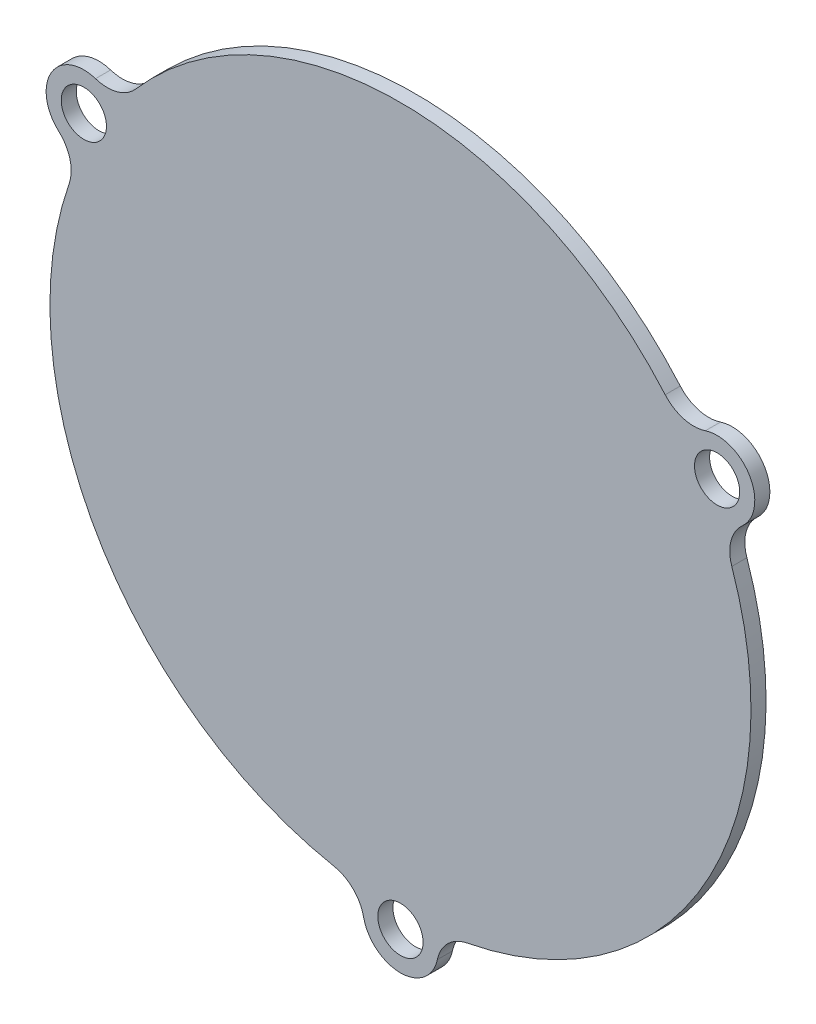
ISO-10303-21;
HEADER;
FILE_DESCRIPTION(('STEP AP214'),'2;1');
FILE_NAME('part.step','',(''),(''),'','','');
FILE_SCHEMA(('AUTOMOTIVE_DESIGN { 1 0 10303 214 1 1 1 1 }'));
ENDSEC;
DATA;
#1=APPLICATION_CONTEXT('core data for automotive mechanical design processes');
#2=APPLICATION_PROTOCOL_DEFINITION('international standard','automotive_design',2000,#1);
#3=PRODUCT_CONTEXT('',#1,'mechanical');
#4=PRODUCT('Part','Part','',(#3));
#5=PRODUCT_RELATED_PRODUCT_CATEGORY('part','',(#4));
#6=PRODUCT_DEFINITION_FORMATION('','',#4);
#7=PRODUCT_DEFINITION_CONTEXT('part definition',#1,'design');
#8=PRODUCT_DEFINITION('design','',#6,#7);
#9=PRODUCT_DEFINITION_SHAPE('','',#8);
#10=(LENGTH_UNIT() NAMED_UNIT(*) SI_UNIT(.MILLI.,.METRE.));
#11=(NAMED_UNIT(*) PLANE_ANGLE_UNIT() SI_UNIT($,.RADIAN.));
#12=(NAMED_UNIT(*) SI_UNIT($,.STERADIAN.) SOLID_ANGLE_UNIT());
#13=UNCERTAINTY_MEASURE_WITH_UNIT(LENGTH_MEASURE(1.E-05),#10,'distance_accuracy_value','');
#14=(GEOMETRIC_REPRESENTATION_CONTEXT(3) GLOBAL_UNCERTAINTY_ASSIGNED_CONTEXT((#13)) GLOBAL_UNIT_ASSIGNED_CONTEXT((#10,
#11,#12)) REPRESENTATION_CONTEXT('',''));
#15=CARTESIAN_POINT('',(0.,0.,0.));
#16=DIRECTION('',(0.,0.,1.));
#17=DIRECTION('',(1.,0.,0.));
#18=AXIS2_PLACEMENT_3D('',#15,#16,#17);
#19=CARTESIAN_POINT('',(-9.78512908426163,-50.5618556701031,4.));
#20=DIRECTION('',(0.,0.,1.));
#21=DIRECTION('',(1.,0.,0.));
#22=AXIS2_PLACEMENT_3D('',#19,#20,#21);
#23=PLANE('',#22);
#24=CARTESIAN_POINT('',(84.004464167091,48.4999999999992,4.));
#25=DIRECTION('',(0.,0.,1.));
#26=DIRECTION('',(1.,0.,0.));
#27=AXIS2_PLACEMENT_3D('',#24,#25,#26);
#28=CIRCLE('',#27,6.);
#29=CARTESIAN_POINT('',(90.004464167091,48.4999999999991,4.));
#30=VERTEX_POINT('',#29);
#31=EDGE_CURVE('E300',#30,#30,#28,.T.);
#32=ORIENTED_EDGE('',*,*,#31,.F.);
#33=EDGE_LOOP('',(#32));
#34=FACE_BOUND('',#33,.T.);
#35=CARTESIAN_POINT('',(0.,0.,4.));
#36=DIRECTION('',(0.,0.,1.));
#37=DIRECTION('',(1.,0.,0.));
#38=AXIS2_PLACEMENT_3D('',#35,#36,#37);
#39=CIRCLE('',#38,93.);
#40=CARTESIAN_POINT('',(-87.908324065782,30.3500668853539,4.));
#41=VERTEX_POINT('',#40);
#42=CARTESIAN_POINT('',(-17.6702331036181,-91.305875287759,4.));
#43=VERTEX_POINT('',#42);
#44=EDGE_CURVE('E165',#41,#43,#39,.T.);
#45=ORIENTED_EDGE('',*,*,#44,.T.);
#46=CARTESIAN_POINT('',(-19.5702581685232,-101.123711340206,4.));
#47=DIRECTION('',(0.,0.,-1.));
#48=DIRECTION('',(1.,0.,0.));
#49=AXIS2_PLACEMENT_3D('',#46,#47,#48);
#50=CIRCLE('',#49,9.99999999999999);
#51=CARTESIAN_POINT('',(-9.78512908426157,-99.0618556701031,4.));
#52=VERTEX_POINT('',#51);
#53=EDGE_CURVE('E134',#43,#52,#50,.T.);
#54=ORIENTED_EDGE('',*,*,#53,.T.);
#55=CARTESIAN_POINT('',(1.19595284297793E-13,-97.,4.));
#56=DIRECTION('',(0.,0.,1.));
#57=DIRECTION('',(1.,0.,0.));
#58=AXIS2_PLACEMENT_3D('',#55,#56,#57);
#59=CIRCLE('',#58,10.);
#60=CARTESIAN_POINT('',(9.7851290842618,-99.0618556701031,4.));
#61=VERTEX_POINT('',#60);
#62=EDGE_CURVE('E168',#52,#61,#59,.T.);
#63=ORIENTED_EDGE('',*,*,#62,.T.);
#64=CARTESIAN_POINT('',(19.5702581685235,-101.123711340206,4.));
#65=DIRECTION('',(0.,0.,-1.));
#66=DIRECTION('',(1.,0.,0.));
#67=AXIS2_PLACEMENT_3D('',#64,#65,#66);
#68=CIRCLE('',#67,10.);
#69=CARTESIAN_POINT('',(17.6702331036183,-91.305875287759,4.));
#70=VERTEX_POINT('',#69);
#71=EDGE_CURVE('E170',#61,#70,#68,.T.);
#72=ORIENTED_EDGE('',*,*,#71,.T.);
#73=CARTESIAN_POINT('',(0.,0.,4.));
#74=DIRECTION('',(0.,0.,1.));
#75=DIRECTION('',(1.,0.,0.));
#76=AXIS2_PLACEMENT_3D('',#73,#74,#75);
#77=CIRCLE('',#76,93.);
#78=CARTESIAN_POINT('',(87.9083240657825,30.3500668853525,4.));
#79=VERTEX_POINT('',#78);
#80=EDGE_CURVE('E172',#70,#79,#77,.T.);
#81=ORIENTED_EDGE('',*,*,#80,.T.);
#82=CARTESIAN_POINT('',(97.3608320298451,33.6135149375409,4.));
#83=DIRECTION('',(0.,0.,-1.));
#84=DIRECTION('',(1.,0.,0.));
#85=AXIS2_PLACEMENT_3D('',#82,#83,#84);
#86=CIRCLE('',#85,10.);
#87=CARTESIAN_POINT('',(90.6826480984681,41.0567574687701,4.));
#88=VERTEX_POINT('',#87);
#89=EDGE_CURVE('E174',#79,#88,#86,.T.);
#90=ORIENTED_EDGE('',*,*,#89,.T.);
#91=CARTESIAN_POINT('',(84.004464167091,48.4999999999992,4.));
#92=DIRECTION('',(0.,0.,1.));
#93=DIRECTION('',(1.,0.,0.));
#94=AXIS2_PLACEMENT_3D('',#91,#92,#93);
#95=CIRCLE('',#94,10.);
#96=CARTESIAN_POINT('',(80.8975190142065,58.0050982013313,4.));
#97=VERTEX_POINT('',#96);
#98=EDGE_CURVE('E176',#88,#97,#95,.T.);
#99=ORIENTED_EDGE('',*,*,#98,.T.);
#100=CARTESIAN_POINT('',(77.7905738613219,67.5101964026634,4.));
#101=DIRECTION('',(0.,0.,-1.));
#102=DIRECTION('',(1.,0.,0.));
#103=AXIS2_PLACEMENT_3D('',#100,#101,#102);
#104=CIRCLE('',#103,10.);
#105=CARTESIAN_POINT('',(70.2380909621645,60.9558084024049,4.));
#106=VERTEX_POINT('',#105);
#107=EDGE_CURVE('E178',#97,#106,#104,.T.);
#108=ORIENTED_EDGE('',*,*,#107,.T.);
#109=CARTESIAN_POINT('',(0.,0.,4.));
#110=DIRECTION('',(0.,0.,1.));
#111=DIRECTION('',(1.,0.,0.));
#112=AXIS2_PLACEMENT_3D('',#109,#110,#111);
#113=CIRCLE('',#112,93.);
#114=CARTESIAN_POINT('',(-70.2380909621637,60.955808402406,4.));
#115=VERTEX_POINT('',#114);
#116=EDGE_CURVE('E180',#106,#115,#113,.T.);
#117=ORIENTED_EDGE('',*,*,#116,.T.);
#118=CARTESIAN_POINT('',(-77.7905738613212,67.5101964026647,4.));
#119=DIRECTION('',(0.,0.,-1.));
#120=DIRECTION('',(1.,0.,0.));
#121=AXIS2_PLACEMENT_3D('',#118,#119,#120);
#122=CIRCLE('',#121,10.);
#123=CARTESIAN_POINT('',(-80.8975190142057,58.0050982013326,4.));
#124=VERTEX_POINT('',#123);
#125=EDGE_CURVE('E182',#115,#124,#122,.T.);
#126=ORIENTED_EDGE('',*,*,#125,.T.);
#127=CARTESIAN_POINT('',(-84.0044641670903,48.5000000000005,4.));
#128=DIRECTION('',(0.,0.,1.));
#129=DIRECTION('',(1.,0.,0.));
#130=AXIS2_PLACEMENT_3D('',#127,#128,#129);
#131=CIRCLE('',#130,10.);
#132=CARTESIAN_POINT('',(-90.6826480984675,41.0567574687715,4.));
#133=VERTEX_POINT('',#132);
#134=EDGE_CURVE('E51',#124,#133,#131,.T.);
#135=ORIENTED_EDGE('',*,*,#134,.T.);
#136=CARTESIAN_POINT('',(-97.3608320298446,33.6135149375425,4.));
#137=DIRECTION('',(0.,0.,-1.));
#138=DIRECTION('',(1.,0.,0.));
#139=AXIS2_PLACEMENT_3D('',#136,#137,#138);
#140=CIRCLE('',#139,10.);
#141=EDGE_CURVE('E46',#133,#41,#140,.T.);
#142=ORIENTED_EDGE('',*,*,#141,.T.);
#143=EDGE_LOOP('',(#45,#54,#63,#72,#81,#90,#99,#108,#117,#126,#135,#142));
#144=FACE_BOUND('',#143,.T.);
#145=CARTESIAN_POINT('',(1.19595284297793E-13,-97.,4.));
#146=DIRECTION('',(0.,0.,1.));
#147=DIRECTION('',(1.,0.,0.));
#148=AXIS2_PLACEMENT_3D('',#145,#146,#147);
#149=CIRCLE('',#148,6.);
#150=CARTESIAN_POINT('',(6.00000000000012,-97.,4.));
#151=VERTEX_POINT('',#150);
#152=EDGE_CURVE('E139',#151,#151,#149,.T.);
#153=ORIENTED_EDGE('',*,*,#152,.F.);
#154=EDGE_LOOP('',(#153));
#155=FACE_BOUND('',#154,.T.);
#156=CARTESIAN_POINT('',(-84.0044641670903,48.5000000000005,4.));
#157=DIRECTION('',(0.,0.,1.));
#158=DIRECTION('',(1.,0.,0.));
#159=AXIS2_PLACEMENT_3D('',#156,#157,#158);
#160=CIRCLE('',#159,6.);
#161=CARTESIAN_POINT('',(-78.0044641670903,48.5000000000005,4.));
#162=VERTEX_POINT('',#161);
#163=EDGE_CURVE('E289',#162,#162,#160,.T.);
#164=ORIENTED_EDGE('',*,*,#163,.F.);
#165=EDGE_LOOP('',(#164));
#166=FACE_BOUND('',#165,.T.);
#167=ADVANCED_FACE('F31',(#34,#144,#155,#166),#23,.T.);
#168=CARTESIAN_POINT('',(-9.78512908426163,-50.5618556701031,0.));
#169=DIRECTION('',(0.,0.,1.));
#170=DIRECTION('',(1.,0.,0.));
#171=AXIS2_PLACEMENT_3D('',#168,#169,#170);
#172=PLANE('',#171);
#173=CARTESIAN_POINT('',(84.004464167091,48.4999999999992,0.));
#174=DIRECTION('',(0.,0.,1.));
#175=DIRECTION('',(1.,0.,0.));
#176=AXIS2_PLACEMENT_3D('',#173,#174,#175);
#177=CIRCLE('',#176,6.);
#178=CARTESIAN_POINT('',(90.004464167091,48.4999999999991,0.));
#179=VERTEX_POINT('',#178);
#180=EDGE_CURVE('E295',#179,#179,#177,.T.);
#181=ORIENTED_EDGE('',*,*,#180,.T.);
#182=EDGE_LOOP('',(#181));
#183=FACE_BOUND('',#182,.T.);
#184=CARTESIAN_POINT('',(0.,0.,0.));
#185=DIRECTION('',(0.,0.,1.));
#186=DIRECTION('',(1.,0.,0.));
#187=AXIS2_PLACEMENT_3D('',#184,#185,#186);
#188=CIRCLE('',#187,93.);
#189=CARTESIAN_POINT('',(-87.908324065782,30.3500668853539,0.));
#190=VERTEX_POINT('',#189);
#191=CARTESIAN_POINT('',(-17.6702331036181,-91.305875287759,0.));
#192=VERTEX_POINT('',#191);
#193=EDGE_CURVE('E125',#190,#192,#188,.T.);
#194=ORIENTED_EDGE('',*,*,#193,.F.);
#195=CARTESIAN_POINT('',(-97.3608320298446,33.6135149375425,0.));
#196=DIRECTION('',(0.,0.,-1.));
#197=DIRECTION('',(1.,0.,0.));
#198=AXIS2_PLACEMENT_3D('',#195,#196,#197);
#199=CIRCLE('',#198,10.);
#200=CARTESIAN_POINT('',(-90.6826480984675,41.0567574687715,0.));
#201=VERTEX_POINT('',#200);
#202=EDGE_CURVE('E163',#201,#190,#199,.T.);
#203=ORIENTED_EDGE('',*,*,#202,.F.);
#204=CARTESIAN_POINT('',(-84.0044641670903,48.5000000000005,0.));
#205=DIRECTION('',(0.,0.,1.));
#206=DIRECTION('',(1.,0.,0.));
#207=AXIS2_PLACEMENT_3D('',#204,#205,#206);
#208=CIRCLE('',#207,10.);
#209=CARTESIAN_POINT('',(-80.8975190142057,58.0050982013326,0.));
#210=VERTEX_POINT('',#209);
#211=EDGE_CURVE('E161',#210,#201,#208,.T.);
#212=ORIENTED_EDGE('',*,*,#211,.F.);
#213=CARTESIAN_POINT('',(-77.7905738613212,67.5101964026647,0.));
#214=DIRECTION('',(0.,0.,-1.));
#215=DIRECTION('',(1.,0.,0.));
#216=AXIS2_PLACEMENT_3D('',#213,#214,#215);
#217=CIRCLE('',#216,10.);
#218=CARTESIAN_POINT('',(-70.2380909621637,60.955808402406,0.));
#219=VERTEX_POINT('',#218);
#220=EDGE_CURVE('E159',#219,#210,#217,.T.);
#221=ORIENTED_EDGE('',*,*,#220,.F.);
#222=CARTESIAN_POINT('',(0.,0.,0.));
#223=DIRECTION('',(0.,0.,1.));
#224=DIRECTION('',(1.,0.,0.));
#225=AXIS2_PLACEMENT_3D('',#222,#223,#224);
#226=CIRCLE('',#225,93.);
#227=CARTESIAN_POINT('',(70.2380909621645,60.9558084024049,0.));
#228=VERTEX_POINT('',#227);
#229=EDGE_CURVE('E157',#228,#219,#226,.T.);
#230=ORIENTED_EDGE('',*,*,#229,.F.);
#231=CARTESIAN_POINT('',(77.7905738613219,67.5101964026634,0.));
#232=DIRECTION('',(0.,0.,-1.));
#233=DIRECTION('',(1.,0.,0.));
#234=AXIS2_PLACEMENT_3D('',#231,#232,#233);
#235=CIRCLE('',#234,10.);
#236=CARTESIAN_POINT('',(80.8975190142065,58.0050982013313,0.));
#237=VERTEX_POINT('',#236);
#238=EDGE_CURVE('E155',#237,#228,#235,.T.);
#239=ORIENTED_EDGE('',*,*,#238,.F.);
#240=CARTESIAN_POINT('',(84.004464167091,48.4999999999992,0.));
#241=DIRECTION('',(0.,0.,1.));
#242=DIRECTION('',(1.,0.,0.));
#243=AXIS2_PLACEMENT_3D('',#240,#241,#242);
#244=CIRCLE('',#243,10.);
#245=CARTESIAN_POINT('',(90.6826480984681,41.0567574687701,0.));
#246=VERTEX_POINT('',#245);
#247=EDGE_CURVE('E153',#246,#237,#244,.T.);
#248=ORIENTED_EDGE('',*,*,#247,.F.);
#249=CARTESIAN_POINT('',(97.3608320298451,33.6135149375409,0.));
#250=DIRECTION('',(0.,0.,-1.));
#251=DIRECTION('',(1.,0.,0.));
#252=AXIS2_PLACEMENT_3D('',#249,#250,#251);
#253=CIRCLE('',#252,10.);
#254=CARTESIAN_POINT('',(87.9083240657825,30.3500668853525,0.));
#255=VERTEX_POINT('',#254);
#256=EDGE_CURVE('E151',#255,#246,#253,.T.);
#257=ORIENTED_EDGE('',*,*,#256,.F.);
#258=CARTESIAN_POINT('',(0.,0.,0.));
#259=DIRECTION('',(0.,0.,1.));
#260=DIRECTION('',(1.,0.,0.));
#261=AXIS2_PLACEMENT_3D('',#258,#259,#260);
#262=CIRCLE('',#261,93.);
#263=CARTESIAN_POINT('',(17.6702331036183,-91.305875287759,0.));
#264=VERTEX_POINT('',#263);
#265=EDGE_CURVE('E149',#264,#255,#262,.T.);
#266=ORIENTED_EDGE('',*,*,#265,.F.);
#267=CARTESIAN_POINT('',(19.5702581685235,-101.123711340206,0.));
#268=DIRECTION('',(0.,0.,-1.));
#269=DIRECTION('',(1.,0.,0.));
#270=AXIS2_PLACEMENT_3D('',#267,#268,#269);
#271=CIRCLE('',#270,10.);
#272=CARTESIAN_POINT('',(9.7851290842618,-99.0618556701031,0.));
#273=VERTEX_POINT('',#272);
#274=EDGE_CURVE('E147',#273,#264,#271,.T.);
#275=ORIENTED_EDGE('',*,*,#274,.F.);
#276=CARTESIAN_POINT('',(1.19570315020717E-13,-97.,0.));
#277=DIRECTION('',(0.,0.,1.));
#278=DIRECTION('',(1.,0.,0.));
#279=AXIS2_PLACEMENT_3D('',#276,#277,#278);
#280=CIRCLE('',#279,10.);
#281=CARTESIAN_POINT('',(-9.78512908426157,-99.0618556701031,0.));
#282=VERTEX_POINT('',#281);
#283=EDGE_CURVE('E127',#282,#273,#280,.T.);
#284=ORIENTED_EDGE('',*,*,#283,.F.);
#285=CARTESIAN_POINT('',(-19.5702581685232,-101.123711340206,0.));
#286=DIRECTION('',(0.,0.,-1.));
#287=DIRECTION('',(1.,0.,0.));
#288=AXIS2_PLACEMENT_3D('',#285,#286,#287);
#289=CIRCLE('',#288,9.99999999999999);
#290=EDGE_CURVE('E120',#192,#282,#289,.T.);
#291=ORIENTED_EDGE('',*,*,#290,.F.);
#292=EDGE_LOOP('',(#194,#203,#212,#221,#230,#239,#248,#257,#266,#275,#284,#291));
#293=FACE_BOUND('',#292,.T.);
#294=CARTESIAN_POINT('',(1.19570315020717E-13,-97.,0.));
#295=DIRECTION('',(0.,0.,1.));
#296=DIRECTION('',(1.,0.,0.));
#297=AXIS2_PLACEMENT_3D('',#294,#295,#296);
#298=CIRCLE('',#297,6.);
#299=CARTESIAN_POINT('',(6.00000000000012,-97.,0.));
#300=VERTEX_POINT('',#299);
#301=EDGE_CURVE('E142',#300,#300,#298,.T.);
#302=ORIENTED_EDGE('',*,*,#301,.T.);
#303=EDGE_LOOP('',(#302));
#304=FACE_BOUND('',#303,.T.);
#305=CARTESIAN_POINT('',(-84.0044641670903,48.5000000000005,0.));
#306=DIRECTION('',(0.,0.,1.));
#307=DIRECTION('',(1.,0.,0.));
#308=AXIS2_PLACEMENT_3D('',#305,#306,#307);
#309=CIRCLE('',#308,6.);
#310=CARTESIAN_POINT('',(-78.0044641670903,48.5000000000005,0.));
#311=VERTEX_POINT('',#310);
#312=EDGE_CURVE('E292',#311,#311,#309,.T.);
#313=ORIENTED_EDGE('',*,*,#312,.T.);
#314=EDGE_LOOP('',(#313));
#315=FACE_BOUND('',#314,.T.);
#316=ADVANCED_FACE('F121',(#183,#293,#304,#315),#172,.F.);
#317=CARTESIAN_POINT('',(0.,0.,4.));
#318=DIRECTION('',(0.,0.,-1.));
#319=DIRECTION('',(-1.,0.,0.));
#320=AXIS2_PLACEMENT_3D('',#317,#318,#319);
#321=CYLINDRICAL_SURFACE('',#320,93.);
#322=ORIENTED_EDGE('',*,*,#193,.T.);
#323=DIRECTION('',(0.,0.,-1.));
#324=VECTOR('',#323,1.);
#325=CARTESIAN_POINT('',(-17.6702331036181,-91.305875287759,4.));
#326=LINE('',#325,#324);
#327=EDGE_CURVE('E11',#43,#192,#326,.T.);
#328=ORIENTED_EDGE('',*,*,#327,.F.);
#329=ORIENTED_EDGE('',*,*,#44,.F.);
#330=DIRECTION('',(0.,0.,-1.));
#331=VECTOR('',#330,1.);
#332=CARTESIAN_POINT('',(-87.908324065782,30.3500668853539,4.));
#333=LINE('',#332,#331);
#334=EDGE_CURVE('E138',#41,#190,#333,.T.);
#335=ORIENTED_EDGE('',*,*,#334,.T.);
#336=EDGE_LOOP('',(#322,#328,#329,#335));
#337=FACE_BOUND('',#336,.T.);
#338=ADVANCED_FACE('F33',(#337),#321,.T.);
#339=CARTESIAN_POINT('',(-19.5702581685232,-101.123711340206,4.));
#340=DIRECTION('',(0.,0.,-1.));
#341=DIRECTION('',(-1.,0.,0.));
#342=AXIS2_PLACEMENT_3D('',#339,#340,#341);
#343=CYLINDRICAL_SURFACE('',#342,9.99999999999999);
#344=ORIENTED_EDGE('',*,*,#290,.T.);
#345=DIRECTION('',(0.,0.,-1.));
#346=VECTOR('',#345,1.);
#347=CARTESIAN_POINT('',(-9.78512908426157,-99.0618556701031,4.));
#348=LINE('',#347,#346);
#349=EDGE_CURVE('E39',#52,#282,#348,.T.);
#350=ORIENTED_EDGE('',*,*,#349,.F.);
#351=ORIENTED_EDGE('',*,*,#53,.F.);
#352=ORIENTED_EDGE('',*,*,#327,.T.);
#353=EDGE_LOOP('',(#344,#350,#351,#352));
#354=FACE_BOUND('',#353,.T.);
#355=ADVANCED_FACE('F133',(#354),#343,.F.);
#356=CARTESIAN_POINT('',(1.19595284297793E-13,-97.,4.));
#357=DIRECTION('',(0.,0.,-1.));
#358=DIRECTION('',(-1.,0.,0.));
#359=AXIS2_PLACEMENT_3D('',#356,#357,#358);
#360=CYLINDRICAL_SURFACE('',#359,10.);
#361=ORIENTED_EDGE('',*,*,#283,.T.);
#362=DIRECTION('',(0.,0.,-1.));
#363=VECTOR('',#362,1.);
#364=CARTESIAN_POINT('',(9.7851290842618,-99.0618556701031,4.));
#365=LINE('',#364,#363);
#366=EDGE_CURVE('E211',#61,#273,#365,.T.);
#367=ORIENTED_EDGE('',*,*,#366,.F.);
#368=ORIENTED_EDGE('',*,*,#62,.F.);
#369=ORIENTED_EDGE('',*,*,#349,.T.);
#370=EDGE_LOOP('',(#361,#367,#368,#369));
#371=FACE_BOUND('',#370,.T.);
#372=ADVANCED_FACE('F215',(#371),#360,.T.);
#373=CARTESIAN_POINT('',(19.5702581685235,-101.123711340206,4.));
#374=DIRECTION('',(0.,0.,-1.));
#375=DIRECTION('',(-1.,0.,0.));
#376=AXIS2_PLACEMENT_3D('',#373,#374,#375);
#377=CYLINDRICAL_SURFACE('',#376,10.);
#378=ORIENTED_EDGE('',*,*,#274,.T.);
#379=DIRECTION('',(0.,0.,-1.));
#380=VECTOR('',#379,1.);
#381=CARTESIAN_POINT('',(17.6702331036183,-91.305875287759,4.));
#382=LINE('',#381,#380);
#383=EDGE_CURVE('E208',#70,#264,#382,.T.);
#384=ORIENTED_EDGE('',*,*,#383,.F.);
#385=ORIENTED_EDGE('',*,*,#71,.F.);
#386=ORIENTED_EDGE('',*,*,#366,.T.);
#387=EDGE_LOOP('',(#378,#384,#385,#386));
#388=FACE_BOUND('',#387,.T.);
#389=ADVANCED_FACE('F223',(#388),#377,.F.);
#390=CARTESIAN_POINT('',(0.,0.,4.));
#391=DIRECTION('',(0.,0.,-1.));
#392=DIRECTION('',(-1.,0.,0.));
#393=AXIS2_PLACEMENT_3D('',#390,#391,#392);
#394=CYLINDRICAL_SURFACE('',#393,93.);
#395=ORIENTED_EDGE('',*,*,#265,.T.);
#396=DIRECTION('',(0.,0.,-1.));
#397=VECTOR('',#396,1.);
#398=CARTESIAN_POINT('',(87.9083240657825,30.3500668853525,4.));
#399=LINE('',#398,#397);
#400=EDGE_CURVE('E205',#79,#255,#399,.T.);
#401=ORIENTED_EDGE('',*,*,#400,.F.);
#402=ORIENTED_EDGE('',*,*,#80,.F.);
#403=ORIENTED_EDGE('',*,*,#383,.T.);
#404=EDGE_LOOP('',(#395,#401,#402,#403));
#405=FACE_BOUND('',#404,.T.);
#406=ADVANCED_FACE('F226',(#405),#394,.T.);
#407=CARTESIAN_POINT('',(97.3608320298451,33.6135149375409,4.));
#408=DIRECTION('',(0.,0.,-1.));
#409=DIRECTION('',(-1.,0.,0.));
#410=AXIS2_PLACEMENT_3D('',#407,#408,#409);
#411=CYLINDRICAL_SURFACE('',#410,10.);
#412=ORIENTED_EDGE('',*,*,#256,.T.);
#413=DIRECTION('',(0.,0.,-1.));
#414=VECTOR('',#413,1.);
#415=CARTESIAN_POINT('',(90.6826480984681,41.0567574687701,4.));
#416=LINE('',#415,#414);
#417=EDGE_CURVE('E202',#88,#246,#416,.T.);
#418=ORIENTED_EDGE('',*,*,#417,.F.);
#419=ORIENTED_EDGE('',*,*,#89,.F.);
#420=ORIENTED_EDGE('',*,*,#400,.T.);
#421=EDGE_LOOP('',(#412,#418,#419,#420));
#422=FACE_BOUND('',#421,.T.);
#423=ADVANCED_FACE('F231',(#422),#411,.F.);
#424=CARTESIAN_POINT('',(84.004464167091,48.4999999999992,4.));
#425=DIRECTION('',(0.,0.,-1.));
#426=DIRECTION('',(-1.,0.,0.));
#427=AXIS2_PLACEMENT_3D('',#424,#425,#426);
#428=CYLINDRICAL_SURFACE('',#427,10.);
#429=ORIENTED_EDGE('',*,*,#247,.T.);
#430=DIRECTION('',(0.,0.,-1.));
#431=VECTOR('',#430,1.);
#432=CARTESIAN_POINT('',(80.8975190142065,58.0050982013313,4.));
#433=LINE('',#432,#431);
#434=EDGE_CURVE('E199',#97,#237,#433,.T.);
#435=ORIENTED_EDGE('',*,*,#434,.F.);
#436=ORIENTED_EDGE('',*,*,#98,.F.);
#437=ORIENTED_EDGE('',*,*,#417,.T.);
#438=EDGE_LOOP('',(#429,#435,#436,#437));
#439=FACE_BOUND('',#438,.T.);
#440=ADVANCED_FACE('F237',(#439),#428,.T.);
#441=CARTESIAN_POINT('',(77.7905738613219,67.5101964026634,4.));
#442=DIRECTION('',(0.,0.,-1.));
#443=DIRECTION('',(-1.,0.,0.));
#444=AXIS2_PLACEMENT_3D('',#441,#442,#443);
#445=CYLINDRICAL_SURFACE('',#444,10.);
#446=ORIENTED_EDGE('',*,*,#238,.T.);
#447=DIRECTION('',(0.,0.,-1.));
#448=VECTOR('',#447,1.);
#449=CARTESIAN_POINT('',(70.2380909621645,60.9558084024049,4.));
#450=LINE('',#449,#448);
#451=EDGE_CURVE('E196',#106,#228,#450,.T.);
#452=ORIENTED_EDGE('',*,*,#451,.F.);
#453=ORIENTED_EDGE('',*,*,#107,.F.);
#454=ORIENTED_EDGE('',*,*,#434,.T.);
#455=EDGE_LOOP('',(#446,#452,#453,#454));
#456=FACE_BOUND('',#455,.T.);
#457=ADVANCED_FACE('F241',(#456),#445,.F.);
#458=CARTESIAN_POINT('',(0.,0.,4.));
#459=DIRECTION('',(0.,0.,-1.));
#460=DIRECTION('',(-1.,0.,0.));
#461=AXIS2_PLACEMENT_3D('',#458,#459,#460);
#462=CYLINDRICAL_SURFACE('',#461,93.);
#463=ORIENTED_EDGE('',*,*,#229,.T.);
#464=DIRECTION('',(0.,0.,-1.));
#465=VECTOR('',#464,1.);
#466=CARTESIAN_POINT('',(-70.2380909621637,60.955808402406,4.));
#467=LINE('',#466,#465);
#468=EDGE_CURVE('E193',#115,#219,#467,.T.);
#469=ORIENTED_EDGE('',*,*,#468,.F.);
#470=ORIENTED_EDGE('',*,*,#116,.F.);
#471=ORIENTED_EDGE('',*,*,#451,.T.);
#472=EDGE_LOOP('',(#463,#469,#470,#471));
#473=FACE_BOUND('',#472,.T.);
#474=ADVANCED_FACE('F246',(#473),#462,.T.);
#475=CARTESIAN_POINT('',(-77.7905738613212,67.5101964026647,4.));
#476=DIRECTION('',(0.,0.,-1.));
#477=DIRECTION('',(-1.,0.,0.));
#478=AXIS2_PLACEMENT_3D('',#475,#476,#477);
#479=CYLINDRICAL_SURFACE('',#478,10.);
#480=ORIENTED_EDGE('',*,*,#220,.T.);
#481=DIRECTION('',(0.,0.,-1.));
#482=VECTOR('',#481,1.);
#483=CARTESIAN_POINT('',(-80.8975190142057,58.0050982013326,4.));
#484=LINE('',#483,#482);
#485=EDGE_CURVE('E190',#124,#210,#484,.T.);
#486=ORIENTED_EDGE('',*,*,#485,.F.);
#487=ORIENTED_EDGE('',*,*,#125,.F.);
#488=ORIENTED_EDGE('',*,*,#468,.T.);
#489=EDGE_LOOP('',(#480,#486,#487,#488));
#490=FACE_BOUND('',#489,.T.);
#491=ADVANCED_FACE('F250',(#490),#479,.F.);
#492=CARTESIAN_POINT('',(-84.0044641670903,48.5000000000005,4.));
#493=DIRECTION('',(0.,0.,-1.));
#494=DIRECTION('',(-1.,0.,0.));
#495=AXIS2_PLACEMENT_3D('',#492,#493,#494);
#496=CYLINDRICAL_SURFACE('',#495,10.);
#497=ORIENTED_EDGE('',*,*,#211,.T.);
#498=DIRECTION('',(0.,0.,-1.));
#499=VECTOR('',#498,1.);
#500=CARTESIAN_POINT('',(-90.6826480984675,41.0567574687715,4.));
#501=LINE('',#500,#499);
#502=EDGE_CURVE('E187',#133,#201,#501,.T.);
#503=ORIENTED_EDGE('',*,*,#502,.F.);
#504=ORIENTED_EDGE('',*,*,#134,.F.);
#505=ORIENTED_EDGE('',*,*,#485,.T.);
#506=EDGE_LOOP('',(#497,#503,#504,#505));
#507=FACE_BOUND('',#506,.T.);
#508=ADVANCED_FACE('F254',(#507),#496,.T.);
#509=CARTESIAN_POINT('',(-97.3608320298446,33.6135149375425,4.));
#510=DIRECTION('',(0.,0.,-1.));
#511=DIRECTION('',(-1.,0.,0.));
#512=AXIS2_PLACEMENT_3D('',#509,#510,#511);
#513=CYLINDRICAL_SURFACE('',#512,10.);
#514=ORIENTED_EDGE('',*,*,#202,.T.);
#515=ORIENTED_EDGE('',*,*,#334,.F.);
#516=ORIENTED_EDGE('',*,*,#141,.F.);
#517=ORIENTED_EDGE('',*,*,#502,.T.);
#518=EDGE_LOOP('',(#514,#515,#516,#517));
#519=FACE_BOUND('',#518,.T.);
#520=ADVANCED_FACE('F256',(#519),#513,.F.);
#521=CARTESIAN_POINT('',(1.19595284297793E-13,-97.,4.));
#522=DIRECTION('',(0.,0.,-1.));
#523=DIRECTION('',(-1.,0.,0.));
#524=AXIS2_PLACEMENT_3D('',#521,#522,#523);
#525=CYLINDRICAL_SURFACE('',#524,6.);
#526=ORIENTED_EDGE('',*,*,#152,.T.);
#527=EDGE_LOOP('',(#526));
#528=FACE_BOUND('',#527,.T.);
#529=ORIENTED_EDGE('',*,*,#301,.F.);
#530=EDGE_LOOP('',(#529));
#531=FACE_BOUND('',#530,.T.);
#532=ADVANCED_FACE('F258',(#528,#531),#525,.F.);
#533=CARTESIAN_POINT('',(84.004464167091,48.4999999999992,4.));
#534=DIRECTION('',(0.,0.,-1.));
#535=DIRECTION('',(-1.,0.,0.));
#536=AXIS2_PLACEMENT_3D('',#533,#534,#535);
#537=CYLINDRICAL_SURFACE('',#536,6.);
#538=ORIENTED_EDGE('',*,*,#31,.T.);
#539=EDGE_LOOP('',(#538));
#540=FACE_BOUND('',#539,.T.);
#541=ORIENTED_EDGE('',*,*,#180,.F.);
#542=EDGE_LOOP('',(#541));
#543=FACE_BOUND('',#542,.T.);
#544=ADVANCED_FACE('F264',(#540,#543),#537,.F.);
#545=CARTESIAN_POINT('',(-84.0044641670903,48.5000000000005,4.));
#546=DIRECTION('',(0.,0.,-1.));
#547=DIRECTION('',(-1.,0.,0.));
#548=AXIS2_PLACEMENT_3D('',#545,#546,#547);
#549=CYLINDRICAL_SURFACE('',#548,6.);
#550=ORIENTED_EDGE('',*,*,#163,.T.);
#551=EDGE_LOOP('',(#550));
#552=FACE_BOUND('',#551,.T.);
#553=ORIENTED_EDGE('',*,*,#312,.F.);
#554=EDGE_LOOP('',(#553));
#555=FACE_BOUND('',#554,.T.);
#556=ADVANCED_FACE('F280',(#552,#555),#549,.F.);
#557=CLOSED_SHELL('',(#167,#316,#338,#355,#372,#389,#406,#423,#440,#457,#474,#491,#508,#520,
#532,#544,#556));
#558=MANIFOLD_SOLID_BREP('B2',#557);
#559=ADVANCED_BREP_SHAPE_REPRESENTATION('',(#18,#558),#14);
#560=SHAPE_DEFINITION_REPRESENTATION(#9,#559);
ENDSEC;
END-ISO-10303-21;
